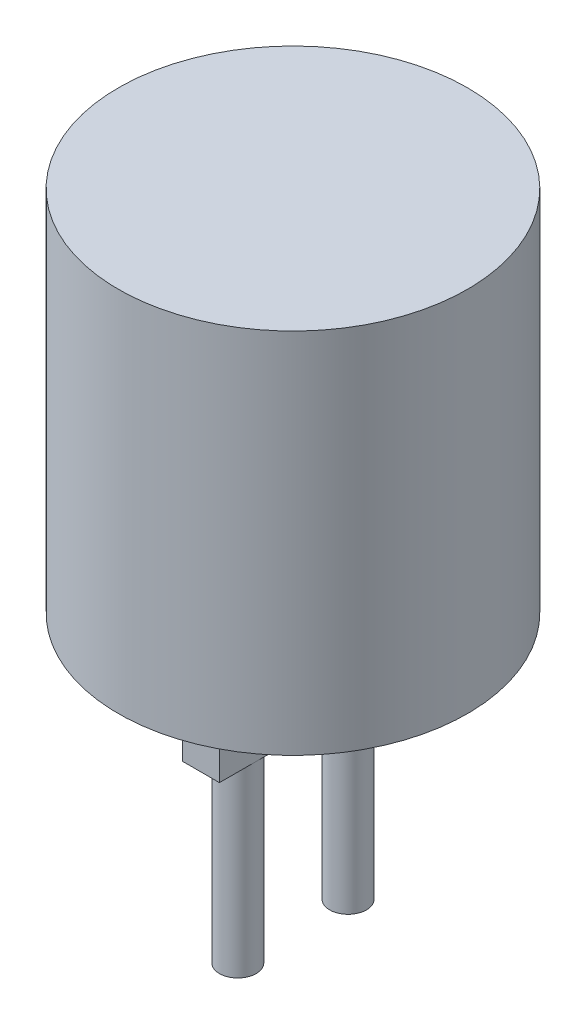
ISO-10303-21;
HEADER;
FILE_DESCRIPTION(('STEP AP214'),'2;1');
FILE_NAME('part.step','',(''),(''),'','','');
FILE_SCHEMA(('AUTOMOTIVE_DESIGN { 1 0 10303 214 1 1 1 1 }'));
ENDSEC;
DATA;
#1=APPLICATION_CONTEXT('core data for automotive mechanical design processes');
#2=APPLICATION_PROTOCOL_DEFINITION('international standard','automotive_design',2000,#1);
#3=PRODUCT_CONTEXT('',#1,'mechanical');
#4=PRODUCT('Part','Part','',(#3));
#5=PRODUCT_RELATED_PRODUCT_CATEGORY('part','',(#4));
#6=PRODUCT_DEFINITION_FORMATION('','',#4);
#7=PRODUCT_DEFINITION_CONTEXT('part definition',#1,'design');
#8=PRODUCT_DEFINITION('design','',#6,#7);
#9=PRODUCT_DEFINITION_SHAPE('','',#8);
#10=(LENGTH_UNIT() NAMED_UNIT(*) SI_UNIT(.MILLI.,.METRE.));
#11=(NAMED_UNIT(*) PLANE_ANGLE_UNIT() SI_UNIT($,.RADIAN.));
#12=(NAMED_UNIT(*) SI_UNIT($,.STERADIAN.) SOLID_ANGLE_UNIT());
#13=UNCERTAINTY_MEASURE_WITH_UNIT(LENGTH_MEASURE(1.E-05),#10,'distance_accuracy_value','');
#14=(GEOMETRIC_REPRESENTATION_CONTEXT(3) GLOBAL_UNCERTAINTY_ASSIGNED_CONTEXT((#13)) GLOBAL_UNIT_ASSIGNED_CONTEXT((#10,
#11,#12)) REPRESENTATION_CONTEXT('',''));
#15=CARTESIAN_POINT('',(0.,0.,0.));
#16=DIRECTION('',(0.,0.,1.));
#17=DIRECTION('',(1.,0.,0.));
#18=AXIS2_PLACEMENT_3D('',#15,#16,#17);
#19=CARTESIAN_POINT('',(0.,0.,0.));
#20=DIRECTION('',(0.,-1.,0.));
#21=DIRECTION('',(0.,0.,-1.));
#22=AXIS2_PLACEMENT_3D('',#19,#20,#21);
#23=PLANE('',#22);
#24=DIRECTION('',(0.,0.,-1.));
#25=VECTOR('',#24,1.);
#26=CARTESIAN_POINT('',(0.999999999999999,0.,-5.));
#27=LINE('',#26,#25);
#28=CARTESIAN_POINT('',(1.,0.,5.));
#29=VERTEX_POINT('',#28);
#30=CARTESIAN_POINT('',(0.999999999999999,0.,-5.));
#31=VERTEX_POINT('',#30);
#32=EDGE_CURVE('E50',#29,#31,#27,.T.);
#33=ORIENTED_EDGE('',*,*,#32,.T.);
#34=DIRECTION('',(-1.,0.,0.));
#35=VECTOR('',#34,1.);
#36=CARTESIAN_POINT('',(-1.,0.,-5.));
#37=LINE('',#36,#35);
#38=CARTESIAN_POINT('',(-1.,0.,-5.));
#39=VERTEX_POINT('',#38);
#40=EDGE_CURVE('E106',#31,#39,#37,.T.);
#41=ORIENTED_EDGE('',*,*,#40,.T.);
#42=DIRECTION('',(0.,0.,1.));
#43=VECTOR('',#42,1.);
#44=CARTESIAN_POINT('',(-1.,0.,-5.));
#45=LINE('',#44,#43);
#46=CARTESIAN_POINT('',(-0.999999999999999,0.,5.));
#47=VERTEX_POINT('',#46);
#48=EDGE_CURVE('E57',#39,#47,#45,.T.);
#49=ORIENTED_EDGE('',*,*,#48,.T.);
#50=DIRECTION('',(1.,0.,0.));
#51=VECTOR('',#50,1.);
#52=CARTESIAN_POINT('',(-0.999999999999999,0.,5.));
#53=LINE('',#52,#51);
#54=EDGE_CURVE('E98',#47,#29,#53,.T.);
#55=ORIENTED_EDGE('',*,*,#54,.T.);
#56=EDGE_LOOP('',(#33,#41,#49,#55));
#57=FACE_BOUND('',#56,.T.);
#58=CARTESIAN_POINT('',(0.,0.,0.));
#59=DIRECTION('',(0.,-1.,0.));
#60=DIRECTION('',(0.,0.,-1.));
#61=AXIS2_PLACEMENT_3D('',#58,#59,#60);
#62=CIRCLE('',#61,9.5);
#63=CARTESIAN_POINT('',(0.,0.,-9.5));
#64=VERTEX_POINT('',#63);
#65=EDGE_CURVE('E142',#64,#64,#62,.T.);
#66=ORIENTED_EDGE('',*,*,#65,.T.);
#67=EDGE_LOOP('',(#66));
#68=FACE_BOUND('',#67,.T.);
#69=ADVANCED_FACE('F36',(#57,#68),#23,.T.);
#70=CARTESIAN_POINT('',(0.,0.,0.));
#71=DIRECTION('',(0.,-1.,0.));
#72=DIRECTION('',(0.,0.,-1.));
#73=AXIS2_PLACEMENT_3D('',#70,#71,#72);
#74=CYLINDRICAL_SURFACE('',#73,9.5);
#75=CARTESIAN_POINT('',(0.,20.,0.));
#76=DIRECTION('',(0.,-1.,0.));
#77=DIRECTION('',(0.,0.,-1.));
#78=AXIS2_PLACEMENT_3D('',#75,#76,#77);
#79=CIRCLE('',#78,9.5);
#80=CARTESIAN_POINT('',(0.,20.,-9.5));
#81=VERTEX_POINT('',#80);
#82=EDGE_CURVE('E140',#81,#81,#79,.T.);
#83=ORIENTED_EDGE('',*,*,#82,.T.);
#84=EDGE_LOOP('',(#83));
#85=FACE_BOUND('',#84,.T.);
#86=ORIENTED_EDGE('',*,*,#65,.F.);
#87=EDGE_LOOP('',(#86));
#88=FACE_BOUND('',#87,.T.);
#89=ADVANCED_FACE('F166',(#85,#88),#74,.T.);
#90=CARTESIAN_POINT('',(9.5,20.,0.));
#91=DIRECTION('',(0.,1.,0.));
#92=DIRECTION('',(0.,0.,1.));
#93=AXIS2_PLACEMENT_3D('',#90,#91,#92);
#94=PLANE('',#93);
#95=ORIENTED_EDGE('',*,*,#82,.F.);
#96=EDGE_LOOP('',(#95));
#97=FACE_BOUND('',#96,.T.);
#98=ADVANCED_FACE('F170',(#97),#94,.T.);
#99=CARTESIAN_POINT('',(0.999999999999999,-5.,-5.));
#100=DIRECTION('',(1.,0.,0.));
#101=DIRECTION('',(0.,0.,-1.));
#102=AXIS2_PLACEMENT_3D('',#99,#100,#101);
#103=PLANE('',#102);
#104=DIRECTION('',(0.,0.,-1.));
#105=VECTOR('',#104,1.);
#106=CARTESIAN_POINT('',(0.999999999999999,-5.,-5.));
#107=LINE('',#106,#105);
#108=CARTESIAN_POINT('',(1.,-5.,5.));
#109=VERTEX_POINT('',#108);
#110=CARTESIAN_POINT('',(1.,-5.,3.));
#111=VERTEX_POINT('',#110);
#112=EDGE_CURVE('E100',#109,#111,#107,.T.);
#113=ORIENTED_EDGE('',*,*,#112,.T.);
#114=CARTESIAN_POINT('',(1.,-5.,-3.));
#115=VERTEX_POINT('',#114);
#116=EDGE_CURVE('E94',#111,#115,#107,.T.);
#117=ORIENTED_EDGE('',*,*,#116,.T.);
#118=CARTESIAN_POINT('',(0.999999999999999,-5.,-5.));
#119=VERTEX_POINT('',#118);
#120=EDGE_CURVE('E87',#115,#119,#107,.T.);
#121=ORIENTED_EDGE('',*,*,#120,.T.);
#122=DIRECTION('',(0.,1.,0.));
#123=VECTOR('',#122,1.);
#124=CARTESIAN_POINT('',(0.999999999999999,-5.,-5.));
#125=LINE('',#124,#123);
#126=EDGE_CURVE('E91',#119,#31,#125,.T.);
#127=ORIENTED_EDGE('',*,*,#126,.T.);
#128=ORIENTED_EDGE('',*,*,#32,.F.);
#129=DIRECTION('',(0.,1.,0.));
#130=VECTOR('',#129,1.);
#131=CARTESIAN_POINT('',(1.,-5.,5.));
#132=LINE('',#131,#130);
#133=EDGE_CURVE('E124',#109,#29,#132,.T.);
#134=ORIENTED_EDGE('',*,*,#133,.F.);
#135=EDGE_LOOP('',(#113,#117,#121,#127,#128,#134));
#136=FACE_BOUND('',#135,.T.);
#137=ADVANCED_FACE('F90',(#136),#103,.T.);
#138=CARTESIAN_POINT('',(-1.,-5.,-5.));
#139=DIRECTION('',(-1.,0.,0.));
#140=DIRECTION('',(0.,0.,1.));
#141=AXIS2_PLACEMENT_3D('',#138,#139,#140);
#142=PLANE('',#141);
#143=DIRECTION('',(0.,0.,1.));
#144=VECTOR('',#143,1.);
#145=CARTESIAN_POINT('',(-1.,-5.,-5.));
#146=LINE('',#145,#144);
#147=CARTESIAN_POINT('',(-1.,-5.,-3.));
#148=VERTEX_POINT('',#147);
#149=CARTESIAN_POINT('',(-1.,-5.,3.));
#150=VERTEX_POINT('',#149);
#151=EDGE_CURVE('E115',#148,#150,#146,.T.);
#152=ORIENTED_EDGE('',*,*,#151,.T.);
#153=CARTESIAN_POINT('',(-0.999999999999999,-5.,5.));
#154=VERTEX_POINT('',#153);
#155=EDGE_CURVE('E113',#150,#154,#146,.T.);
#156=ORIENTED_EDGE('',*,*,#155,.T.);
#157=DIRECTION('',(0.,1.,0.));
#158=VECTOR('',#157,1.);
#159=CARTESIAN_POINT('',(-0.999999999999999,-5.,5.));
#160=LINE('',#159,#158);
#161=EDGE_CURVE('E128',#154,#47,#160,.T.);
#162=ORIENTED_EDGE('',*,*,#161,.T.);
#163=ORIENTED_EDGE('',*,*,#48,.F.);
#164=DIRECTION('',(0.,1.,0.));
#165=VECTOR('',#164,1.);
#166=CARTESIAN_POINT('',(-1.,-5.,-5.));
#167=LINE('',#166,#165);
#168=CARTESIAN_POINT('',(-1.,-5.,-5.));
#169=VERTEX_POINT('',#168);
#170=EDGE_CURVE('E107',#169,#39,#167,.T.);
#171=ORIENTED_EDGE('',*,*,#170,.F.);
#172=EDGE_CURVE('E112',#169,#148,#146,.T.);
#173=ORIENTED_EDGE('',*,*,#172,.T.);
#174=EDGE_LOOP('',(#152,#156,#162,#163,#171,#173));
#175=FACE_BOUND('',#174,.T.);
#176=ADVANCED_FACE('F156',(#175),#142,.T.);
#177=CARTESIAN_POINT('',(0.,-5.,0.));
#178=DIRECTION('',(0.,1.,0.));
#179=DIRECTION('',(0.,0.,1.));
#180=AXIS2_PLACEMENT_3D('',#177,#178,#179);
#181=PLANE('',#180);
#182=CARTESIAN_POINT('',(0.,-5.,3.));
#183=DIRECTION('',(0.,1.,0.));
#184=DIRECTION('',(0.,0.,1.));
#185=AXIS2_PLACEMENT_3D('',#182,#183,#184);
#186=CIRCLE('',#185,1.);
#187=EDGE_CURVE('E133',#150,#111,#186,.F.);
#188=ORIENTED_EDGE('',*,*,#187,.F.);
#189=ORIENTED_EDGE('',*,*,#151,.F.);
#190=CARTESIAN_POINT('',(0.,-5.,-3.));
#191=DIRECTION('',(0.,1.,0.));
#192=DIRECTION('',(0.,0.,1.));
#193=AXIS2_PLACEMENT_3D('',#190,#191,#192);
#194=CIRCLE('',#193,1.);
#195=EDGE_CURVE('E39',#115,#148,#194,.F.);
#196=ORIENTED_EDGE('',*,*,#195,.F.);
#197=ORIENTED_EDGE('',*,*,#116,.F.);
#198=EDGE_LOOP('',(#188,#189,#196,#197));
#199=FACE_BOUND('',#198,.T.);
#200=ADVANCED_FACE('F152',(#199),#181,.F.);
#201=EDGE_CURVE('E11',#148,#115,#194,.F.);
#202=ORIENTED_EDGE('',*,*,#201,.F.);
#203=ORIENTED_EDGE('',*,*,#172,.F.);
#204=DIRECTION('',(-1.,0.,0.));
#205=VECTOR('',#204,1.);
#206=CARTESIAN_POINT('',(-1.,-5.,-5.));
#207=LINE('',#206,#205);
#208=EDGE_CURVE('E105',#119,#169,#207,.T.);
#209=ORIENTED_EDGE('',*,*,#208,.F.);
#210=ORIENTED_EDGE('',*,*,#120,.F.);
#211=EDGE_LOOP('',(#202,#203,#209,#210));
#212=FACE_BOUND('',#211,.T.);
#213=ADVANCED_FACE('F111',(#212),#181,.F.);
#214=CARTESIAN_POINT('',(-0.999999999999999,-5.,5.));
#215=DIRECTION('',(0.,0.,1.));
#216=DIRECTION('',(1.,0.,0.));
#217=AXIS2_PLACEMENT_3D('',#214,#215,#216);
#218=PLANE('',#217);
#219=ORIENTED_EDGE('',*,*,#54,.F.);
#220=ORIENTED_EDGE('',*,*,#161,.F.);
#221=DIRECTION('',(1.,0.,0.));
#222=VECTOR('',#221,1.);
#223=CARTESIAN_POINT('',(-0.999999999999999,-5.,5.));
#224=LINE('',#223,#222);
#225=EDGE_CURVE('E108',#154,#109,#224,.T.);
#226=ORIENTED_EDGE('',*,*,#225,.T.);
#227=ORIENTED_EDGE('',*,*,#133,.T.);
#228=EDGE_LOOP('',(#219,#220,#226,#227));
#229=FACE_BOUND('',#228,.T.);
#230=ADVANCED_FACE('F164',(#229),#218,.T.);
#231=CARTESIAN_POINT('',(-1.,-5.,-5.));
#232=DIRECTION('',(0.,0.,-1.));
#233=DIRECTION('',(-1.,0.,0.));
#234=AXIS2_PLACEMENT_3D('',#231,#232,#233);
#235=PLANE('',#234);
#236=ORIENTED_EDGE('',*,*,#40,.F.);
#237=ORIENTED_EDGE('',*,*,#126,.F.);
#238=ORIENTED_EDGE('',*,*,#208,.T.);
#239=ORIENTED_EDGE('',*,*,#170,.T.);
#240=EDGE_LOOP('',(#236,#237,#238,#239));
#241=FACE_BOUND('',#240,.T.);
#242=ADVANCED_FACE('F103',(#241),#235,.T.);
#243=EDGE_CURVE('E127',#111,#150,#186,.F.);
#244=ORIENTED_EDGE('',*,*,#243,.F.);
#245=ORIENTED_EDGE('',*,*,#112,.F.);
#246=ORIENTED_EDGE('',*,*,#225,.F.);
#247=ORIENTED_EDGE('',*,*,#155,.F.);
#248=EDGE_LOOP('',(#244,#245,#246,#247));
#249=FACE_BOUND('',#248,.T.);
#250=ADVANCED_FACE('F160',(#249),#181,.F.);
#251=CARTESIAN_POINT('',(0.,-15.,3.));
#252=DIRECTION('',(0.,1.,0.));
#253=DIRECTION('',(0.,0.,1.));
#254=AXIS2_PLACEMENT_3D('',#251,#252,#253);
#255=PLANE('',#254);
#256=CARTESIAN_POINT('',(0.,-15.,3.));
#257=DIRECTION('',(0.,1.,0.));
#258=DIRECTION('',(0.,0.,1.));
#259=AXIS2_PLACEMENT_3D('',#256,#257,#258);
#260=CIRCLE('',#259,1.);
#261=CARTESIAN_POINT('',(0.,-15.,4.));
#262=VERTEX_POINT('',#261);
#263=EDGE_CURVE('E137',#262,#262,#260,.T.);
#264=ORIENTED_EDGE('',*,*,#263,.F.);
#265=EDGE_LOOP('',(#264));
#266=FACE_BOUND('',#265,.T.);
#267=ADVANCED_FACE('F183',(#266),#255,.F.);
#268=CARTESIAN_POINT('',(0.,-15.,3.));
#269=DIRECTION('',(0.,1.,0.));
#270=DIRECTION('',(0.,0.,1.));
#271=AXIS2_PLACEMENT_3D('',#268,#269,#270);
#272=CYLINDRICAL_SURFACE('',#271,1.);
#273=ORIENTED_EDGE('',*,*,#263,.T.);
#274=EDGE_LOOP('',(#273));
#275=FACE_BOUND('',#274,.T.);
#276=ORIENTED_EDGE('',*,*,#243,.T.);
#277=ORIENTED_EDGE('',*,*,#187,.T.);
#278=EDGE_LOOP('',(#276,#277));
#279=FACE_BOUND('',#278,.T.);
#280=ADVANCED_FACE('F179',(#275,#279),#272,.T.);
#281=CARTESIAN_POINT('',(0.,-15.,-3.));
#282=DIRECTION('',(0.,1.,0.));
#283=DIRECTION('',(0.,0.,1.));
#284=AXIS2_PLACEMENT_3D('',#281,#282,#283);
#285=PLANE('',#284);
#286=CARTESIAN_POINT('',(0.,-15.,-3.));
#287=DIRECTION('',(0.,1.,0.));
#288=DIRECTION('',(0.,0.,1.));
#289=AXIS2_PLACEMENT_3D('',#286,#287,#288);
#290=CIRCLE('',#289,1.);
#291=CARTESIAN_POINT('',(0.,-15.,-2.));
#292=VERTEX_POINT('',#291);
#293=EDGE_CURVE('E134',#292,#292,#290,.T.);
#294=ORIENTED_EDGE('',*,*,#293,.F.);
#295=EDGE_LOOP('',(#294));
#296=FACE_BOUND('',#295,.T.);
#297=ADVANCED_FACE('F182',(#296),#285,.F.);
#298=CARTESIAN_POINT('',(0.,-15.,-3.));
#299=DIRECTION('',(0.,1.,0.));
#300=DIRECTION('',(0.,0.,1.));
#301=AXIS2_PLACEMENT_3D('',#298,#299,#300);
#302=CYLINDRICAL_SURFACE('',#301,1.);
#303=ORIENTED_EDGE('',*,*,#293,.T.);
#304=EDGE_LOOP('',(#303));
#305=FACE_BOUND('',#304,.T.);
#306=ORIENTED_EDGE('',*,*,#195,.T.);
#307=ORIENTED_EDGE('',*,*,#201,.T.);
#308=EDGE_LOOP('',(#306,#307));
#309=FACE_BOUND('',#308,.T.);
#310=ADVANCED_FACE('F148',(#305,#309),#302,.T.);
#311=CLOSED_SHELL('',(#69,#89,#98,#137,#176,#200,#213,#230,#242,#250,#267,#280,#297,#310));
#312=MANIFOLD_SOLID_BREP('B2',#311);
#313=ADVANCED_BREP_SHAPE_REPRESENTATION('',(#18,#312),#14);
#314=SHAPE_DEFINITION_REPRESENTATION(#9,#313);
ENDSEC;
END-ISO-10303-21;
